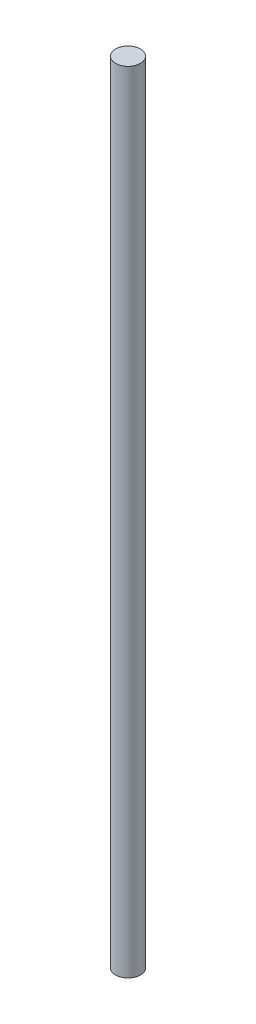
ISO-10303-21;
HEADER;
FILE_DESCRIPTION(('STEP AP214'),'2;1');
FILE_NAME('part.step','',(''),(''),'','','');
FILE_SCHEMA(('AUTOMOTIVE_DESIGN { 1 0 10303 214 1 1 1 1 }'));
ENDSEC;
DATA;
#1=APPLICATION_CONTEXT('core data for automotive mechanical design processes');
#2=APPLICATION_PROTOCOL_DEFINITION('international standard','automotive_design',2000,#1);
#3=PRODUCT_CONTEXT('',#1,'mechanical');
#4=PRODUCT('Part','Part','',(#3));
#5=PRODUCT_RELATED_PRODUCT_CATEGORY('part','',(#4));
#6=PRODUCT_DEFINITION_FORMATION('','',#4);
#7=PRODUCT_DEFINITION_CONTEXT('part definition',#1,'design');
#8=PRODUCT_DEFINITION('design','',#6,#7);
#9=PRODUCT_DEFINITION_SHAPE('','',#8);
#10=(LENGTH_UNIT() NAMED_UNIT(*) SI_UNIT(.MILLI.,.METRE.));
#11=(NAMED_UNIT(*) PLANE_ANGLE_UNIT() SI_UNIT($,.RADIAN.));
#12=(NAMED_UNIT(*) SI_UNIT($,.STERADIAN.) SOLID_ANGLE_UNIT());
#13=UNCERTAINTY_MEASURE_WITH_UNIT(LENGTH_MEASURE(1.E-05),#10,'distance_accuracy_value','');
#14=(GEOMETRIC_REPRESENTATION_CONTEXT(3) GLOBAL_UNCERTAINTY_ASSIGNED_CONTEXT((#13)) GLOBAL_UNIT_ASSIGNED_CONTEXT((#10,
#11,#12)) REPRESENTATION_CONTEXT('',''));
#15=CARTESIAN_POINT('',(0.,0.,0.));
#16=DIRECTION('',(0.,0.,1.));
#17=DIRECTION('',(1.,0.,0.));
#18=AXIS2_PLACEMENT_3D('',#15,#16,#17);
#19=CARTESIAN_POINT('',(550.,780.,-300.));
#20=DIRECTION('',(0.,-1.,0.));
#21=DIRECTION('',(0.,0.,-1.));
#22=AXIS2_PLACEMENT_3D('',#19,#20,#21);
#23=CYLINDRICAL_SURFACE('',#22,6.00000000000001);
#24=CARTESIAN_POINT('',(550.,780.,-300.));
#25=DIRECTION('',(0.,1.,0.));
#26=DIRECTION('',(0.,0.,1.));
#27=AXIS2_PLACEMENT_3D('',#24,#25,#26);
#28=CIRCLE('',#27,6.00000000000001);
#29=CARTESIAN_POINT('',(550.,780.,-294.));
#30=VERTEX_POINT('',#29);
#31=EDGE_CURVE('E10',#30,#30,#28,.T.);
#32=ORIENTED_EDGE('',*,*,#31,.F.);
#33=EDGE_LOOP('',(#32));
#34=FACE_BOUND('',#33,.T.);
#35=CARTESIAN_POINT('',(550.,400.,-300.));
#36=DIRECTION('',(0.,1.,0.));
#37=DIRECTION('',(0.,0.,1.));
#38=AXIS2_PLACEMENT_3D('',#35,#36,#37);
#39=CIRCLE('',#38,6.00000000000001);
#40=CARTESIAN_POINT('',(550.,400.,-294.));
#41=VERTEX_POINT('',#40);
#42=EDGE_CURVE('E40',#41,#41,#39,.T.);
#43=ORIENTED_EDGE('',*,*,#42,.T.);
#44=EDGE_LOOP('',(#43));
#45=FACE_BOUND('',#44,.T.);
#46=ADVANCED_FACE('F37',(#34,#45),#23,.T.);
#47=CARTESIAN_POINT('',(550.,780.,-300.));
#48=DIRECTION('',(0.,1.,0.));
#49=DIRECTION('',(0.,0.,1.));
#50=AXIS2_PLACEMENT_3D('',#47,#48,#49);
#51=PLANE('',#50);
#52=ORIENTED_EDGE('',*,*,#31,.T.);
#53=EDGE_LOOP('',(#52));
#54=FACE_BOUND('',#53,.T.);
#55=ADVANCED_FACE('F52',(#54),#51,.T.);
#56=CARTESIAN_POINT('',(550.,400.,-300.));
#57=DIRECTION('',(0.,1.,0.));
#58=DIRECTION('',(0.,0.,1.));
#59=AXIS2_PLACEMENT_3D('',#56,#57,#58);
#60=PLANE('',#59);
#61=ORIENTED_EDGE('',*,*,#42,.F.);
#62=EDGE_LOOP('',(#61));
#63=FACE_BOUND('',#62,.T.);
#64=ADVANCED_FACE('F50',(#63),#60,.F.);
#65=CLOSED_SHELL('',(#46,#55,#64));
#66=MANIFOLD_SOLID_BREP('B2',#65);
#67=ADVANCED_BREP_SHAPE_REPRESENTATION('',(#18,#66),#14);
#68=SHAPE_DEFINITION_REPRESENTATION(#9,#67);
ENDSEC;
END-ISO-10303-21;
